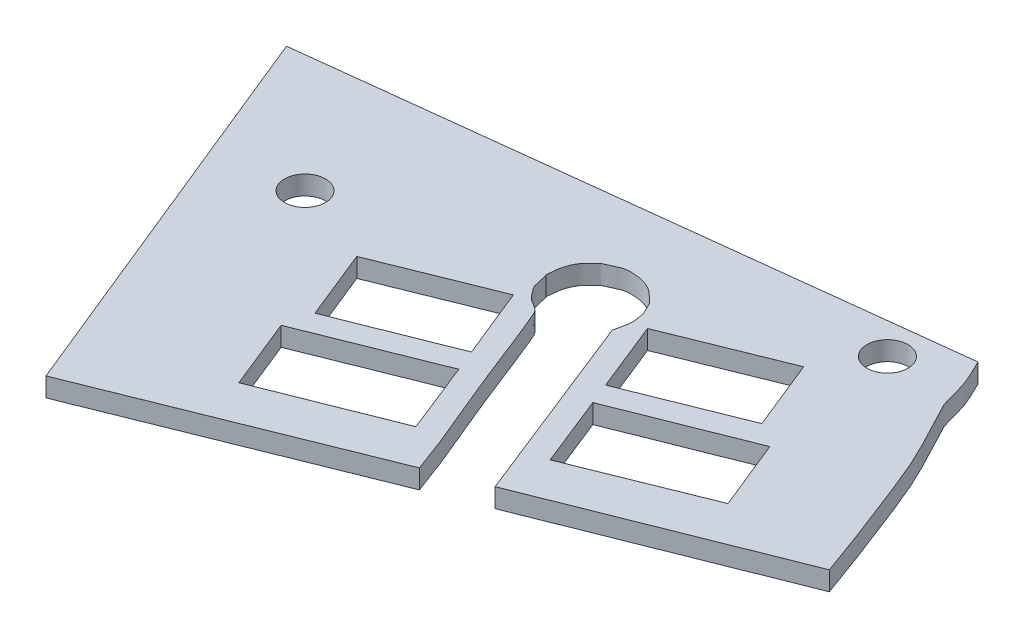
ISO-10303-21;
HEADER;
FILE_DESCRIPTION(('STEP AP214'),'2;1');
FILE_NAME('part.step','',(''),(''),'','','');
FILE_SCHEMA(('AUTOMOTIVE_DESIGN { 1 0 10303 214 1 1 1 1 }'));
ENDSEC;
DATA;
#1=APPLICATION_CONTEXT('core data for automotive mechanical design processes');
#2=APPLICATION_PROTOCOL_DEFINITION('international standard','automotive_design',2000,#1);
#3=PRODUCT_CONTEXT('',#1,'mechanical');
#4=PRODUCT('Part','Part','',(#3));
#5=PRODUCT_RELATED_PRODUCT_CATEGORY('part','',(#4));
#6=PRODUCT_DEFINITION_FORMATION('','',#4);
#7=PRODUCT_DEFINITION_CONTEXT('part definition',#1,'design');
#8=PRODUCT_DEFINITION('design','',#6,#7);
#9=PRODUCT_DEFINITION_SHAPE('','',#8);
#10=(LENGTH_UNIT() NAMED_UNIT(*) SI_UNIT(.MILLI.,.METRE.));
#11=(NAMED_UNIT(*) PLANE_ANGLE_UNIT() SI_UNIT($,.RADIAN.));
#12=(NAMED_UNIT(*) SI_UNIT($,.STERADIAN.) SOLID_ANGLE_UNIT());
#13=UNCERTAINTY_MEASURE_WITH_UNIT(LENGTH_MEASURE(1.E-05),#10,'distance_accuracy_value','');
#14=(GEOMETRIC_REPRESENTATION_CONTEXT(3) GLOBAL_UNCERTAINTY_ASSIGNED_CONTEXT((#13)) GLOBAL_UNIT_ASSIGNED_CONTEXT((#10,
#11,#12)) REPRESENTATION_CONTEXT('',''));
#15=CARTESIAN_POINT('',(0.,0.,0.));
#16=DIRECTION('',(0.,0.,1.));
#17=DIRECTION('',(1.,0.,0.));
#18=AXIS2_PLACEMENT_3D('',#15,#16,#17);
#19=CARTESIAN_POINT('',(35.9788581902602,1.19,-26.9467232131162));
#20=DIRECTION('',(0.,-1.,0.));
#21=DIRECTION('',(0.,0.,-1.));
#22=AXIS2_PLACEMENT_3D('',#19,#20,#21);
#23=PLANE('',#22);
#24=DIRECTION('',(-0.929138932775586,0.,0.369730771779472));
#25=VECTOR('',#24,1.);
#26=CARTESIAN_POINT('',(24.8826001834326,1.19,-16.1536096345668));
#27=LINE('',#26,#25);
#28=CARTESIAN_POINT('',(32.786623966637,1.19,-19.2988451966992));
#29=VERTEX_POINT('',#28);
#30=CARTESIAN_POINT('',(24.8826001834326,1.19,-16.1536096345668));
#31=VERTEX_POINT('',#30);
#32=EDGE_CURVE('E249',#29,#31,#27,.T.);
#33=ORIENTED_EDGE('',*,*,#32,.F.);
#34=DIRECTION('',(-0.374554351369243,0.,-0.927204960011737));
#35=VECTOR('',#34,1.);
#36=CARTESIAN_POINT('',(32.786623966637,1.19,-19.2988451966992));
#37=LINE('',#36,#35);
#38=CARTESIAN_POINT('',(34.559807217706,1.19,-14.9093505895999));
#39=VERTEX_POINT('',#38);
#40=EDGE_CURVE('E260',#39,#29,#37,.T.);
#41=ORIENTED_EDGE('',*,*,#40,.F.);
#42=DIRECTION('',(0.927574779548119,0.,-0.3736375628149));
#43=VECTOR('',#42,1.);
#44=CARTESIAN_POINT('',(34.559807217706,1.19,-14.9093505895999));
#45=LINE('',#44,#43);
#46=CARTESIAN_POINT('',(26.6479258883437,1.19,-11.7223557269067));
#47=VERTEX_POINT('',#46);
#48=EDGE_CURVE('E256',#47,#39,#45,.T.);
#49=ORIENTED_EDGE('',*,*,#48,.F.);
#50=DIRECTION('',(0.370093426325255,0.,0.928994540237365));
#51=VECTOR('',#50,1.);
#52=CARTESIAN_POINT('',(26.6479258883437,1.19,-11.7223557269067));
#53=LINE('',#52,#51);
#54=EDGE_CURVE('E252',#31,#47,#53,.T.);
#55=ORIENTED_EDGE('',*,*,#54,.F.);
#56=EDGE_LOOP('',(#33,#41,#49,#55));
#57=FACE_BOUND('',#56,.T.);
#58=CARTESIAN_POINT('',(4.44394552127311,1.19,-18.6221592118428));
#59=DIRECTION('',(0.,1.,0.));
#60=DIRECTION('',(0.,0.,1.));
#61=AXIS2_PLACEMENT_3D('',#58,#59,#60);
#62=CIRCLE('',#61,1.27912148996529);
#63=CARTESIAN_POINT('',(4.44394552127311,1.19,-17.3430377218775));
#64=VERTEX_POINT('',#63);
#65=EDGE_CURVE('E335',#64,#64,#62,.T.);
#66=ORIENTED_EDGE('',*,*,#65,.F.);
#67=EDGE_LOOP('',(#66));
#68=FACE_BOUND('',#67,.T.);
#69=DIRECTION('',(-0.927373213546552,0.,0.374137572019093));
#70=VECTOR('',#69,1.);
#71=CARTESIAN_POINT('',(22.5826617144535,1.19,-21.8660149868715));
#72=LINE('',#71,#70);
#73=CARTESIAN_POINT('',(29.5280116278823,1.19,-24.6680328966792));
#74=VERTEX_POINT('',#73);
#75=CARTESIAN_POINT('',(22.5826617144535,1.19,-21.8660149868715));
#76=VERTEX_POINT('',#75);
#77=EDGE_CURVE('E343',#74,#76,#72,.T.);
#78=ORIENTED_EDGE('',*,*,#77,.F.);
#79=DIRECTION('',(-0.374514129456685,0.,-0.927221207068357));
#80=VECTOR('',#79,1.);
#81=CARTESIAN_POINT('',(29.5280116278823,1.19,-24.6680328966792));
#82=LINE('',#81,#80);
#83=CARTESIAN_POINT('',(31.2953894742109,1.19,-20.2923629522742));
#84=VERTEX_POINT('',#83);
#85=EDGE_CURVE('E354',#84,#74,#82,.T.);
#86=ORIENTED_EDGE('',*,*,#85,.F.);
#87=DIRECTION('',(0.927982637445173,0.,-0.372623435387928));
#88=VECTOR('',#87,1.);
#89=CARTESIAN_POINT('',(31.2953894742109,1.19,-20.2923629522742));
#90=LINE('',#89,#88);
#91=CARTESIAN_POINT('',(24.3349122983001,1.19,-17.4974432926051));
#92=VERTEX_POINT('',#91);
#93=EDGE_CURVE('E350',#92,#84,#90,.T.);
#94=ORIENTED_EDGE('',*,*,#93,.F.);
#95=DIRECTION('',(0.372273642828144,0.,0.928123017091734));
#96=VECTOR('',#95,1.);
#97=CARTESIAN_POINT('',(24.3349122983001,1.19,-17.4974432926051));
#98=LINE('',#97,#96);
#99=EDGE_CURVE('E346',#76,#92,#98,.T.);
#100=ORIENTED_EDGE('',*,*,#99,.F.);
#101=EDGE_LOOP('',(#78,#86,#94,#100));
#102=FACE_BOUND('',#101,.T.);
#103=DIRECTION('',(0.377265914837246,0.,0.926104977581924));
#104=VECTOR('',#103,1.);
#105=CARTESIAN_POINT('',(6.37170948359056,1.19,-0.524718751833313));
#106=LINE('',#105,#104);
#107=CARTESIAN_POINT('',(-3.94816815876049,1.19,-25.8577522349688));
#108=VERTEX_POINT('',#107);
#109=CARTESIAN_POINT('',(6.37170948359056,1.19,-0.524718751833313));
#110=VERTEX_POINT('',#109);
#111=EDGE_CURVE('E394',#108,#110,#106,.T.);
#112=ORIENTED_EDGE('',*,*,#111,.T.);
#113=DIRECTION('',(0.927877448229034,0.,-0.372885292104658));
#114=VECTOR('',#113,1.);
#115=CARTESIAN_POINT('',(22.9999228700686,1.19,-7.20708420605326));
#116=LINE('',#115,#114);
#117=CARTESIAN_POINT('',(22.9999228700686,1.19,-7.20708420605326));
#118=VERTEX_POINT('',#117);
#119=EDGE_CURVE('E398',#110,#118,#116,.T.);
#120=ORIENTED_EDGE('',*,*,#119,.T.);
#121=CARTESIAN_POINT('',(22.9999228700686,1.19,-7.20708420605326));
#122=CARTESIAN_POINT('',(22.0115475346655,1.19,-9.98661151399347));
#123=CARTESIAN_POINT('',(21.5188945967217,1.19,-10.8820647279259));
#124=CARTESIAN_POINT('',(20.0021583951109,1.19,-14.686998305048));
#125=CARTESIAN_POINT('',(19.3466827716481,1.19,-16.3313456912646));
#126=CARTESIAN_POINT('',(19.1275109478908,1.19,-16.988826809381));
#127=CARTESIAN_POINT('',(18.2342460124436,1.19,-19.0982296967628));
#128=CARTESIAN_POINT('',(18.0311634837373,1.19,-19.5777994810791));
#129=CARTESIAN_POINT('',(17.4655783405814,1.19,-19.6171123035761));
#130=CARTESIAN_POINT('',(17.1976734702197,1.19,-20.0183884446883));
#131=CARTESIAN_POINT('',(17.0440445021911,1.19,-20.2484986303312));
#132=CARTESIAN_POINT('',(16.8068058528764,1.19,-20.4410440927477));
#133=CARTESIAN_POINT('',(16.7367865661339,1.19,-20.708719001617));
#134=CARTESIAN_POINT('',(16.6637645790077,1.19,-20.9878728556309));
#135=CARTESIAN_POINT('',(16.617400623009,1.19,-21.2735503084374));
#136=CARTESIAN_POINT('',(16.5443786358828,1.19,-21.5527041624513));
#137=CARTESIAN_POINT('',(16.5398013319158,1.19,-21.5702026186516));
#138=CARTESIAN_POINT('',(16.5187823531704,1.19,-21.5782662639945));
#139=CARTESIAN_POINT('',(16.5059842118141,1.19,-21.5910473147661));
#140=B_SPLINE_CURVE_WITH_KNOTS('',3,(#121,#122,#123,#124,#125,#126,#127,#128,#129,#130,#131,
#132,#133,#134,#135,#136,#137,#138,#139),.UNSPECIFIED.,.F.,.F.,(4,3,3,3,3,3,4),(0.,1.,2.,3.,4.,
5.,6.),.UNSPECIFIED.);
#141=CARTESIAN_POINT('',(16.5059842118141,1.19,-21.5910473147661));
#142=VERTEX_POINT('',#141);
#143=EDGE_CURVE('E402',#118,#142,#140,.T.);
#144=ORIENTED_EDGE('',*,*,#143,.T.);
#145=CARTESIAN_POINT('',(16.5059842118141,1.19,-21.5910473147661));
#146=CARTESIAN_POINT('',(16.5442005480148,1.19,-21.885227935876));
#147=CARTESIAN_POINT('',(16.5456222551934,1.19,-22.1865768416264));
#148=CARTESIAN_POINT('',(16.6206332204162,1.19,-22.4735891780956));
#149=CARTESIAN_POINT('',(16.6873028559704,1.19,-22.7286853205747));
#150=CARTESIAN_POINT('',(16.7797045426985,1.19,-22.9842094668508));
#151=CARTESIAN_POINT('',(16.927205728982,1.19,-23.2027553024496));
#152=CARTESIAN_POINT('',(17.1043517025042,1.19,-23.4652244783381));
#153=CARTESIAN_POINT('',(17.3614582266607,1.19,-23.6637417898316));
#154=CARTESIAN_POINT('',(17.5791172474616,1.19,-23.8937316045859));
#155=CARTESIAN_POINT('',(17.5915498323038,1.19,-23.9068685188028));
#156=CARTESIAN_POINT('',(17.6011399453458,1.19,-23.9243355141276));
#157=CARTESIAN_POINT('',(17.6174661535773,1.19,-23.9321202816761));
#158=CARTESIAN_POINT('',(17.8706540099005,1.19,-24.0528469427378));
#159=CARTESIAN_POINT('',(18.1314751599277,1.19,-24.157110454786));
#160=CARTESIAN_POINT('',(18.3846630162509,1.19,-24.2778371158476));
#161=CARTESIAN_POINT('',(18.7432825901617,1.19,-24.4488364061703));
#162=CARTESIAN_POINT('',(19.1802781374837,1.19,-24.4079919107509));
#163=CARTESIAN_POINT('',(19.5740557849677,1.19,-24.3551911491583));
#164=CARTESIAN_POINT('',(19.870796871569,1.19,-24.3154018023823));
#165=CARTESIAN_POINT('',(20.1598661302531,1.19,-24.1997934174334));
#166=CARTESIAN_POINT('',(20.4183282841305,1.19,-24.0486782970542));
#167=CARTESIAN_POINT('',(20.6925799422208,1.19,-23.888331524017));
#168=CARTESIAN_POINT('',(20.9054886390425,1.19,-23.640779489755));
#169=CARTESIAN_POINT('',(21.1476534923825,1.19,-23.4351554556649));
#170=CARTESIAN_POINT('',(21.3834549378282,1.19,-23.2349346400177));
#171=CARTESIAN_POINT('',(21.4548822220276,1.19,-22.8981514571216));
#172=CARTESIAN_POINT('',(21.6084965868502,1.19,-22.62964945785));
#173=CARTESIAN_POINT('',(21.6174785008867,1.19,-22.6139500024059));
#174=CARTESIAN_POINT('',(21.6439024964264,1.19,-22.6091401363415));
#175=CARTESIAN_POINT('',(21.6468852639403,1.19,-22.5913005517343));
#176=CARTESIAN_POINT('',(21.6958062885552,1.19,-22.2987096093937));
#177=CARTESIAN_POINT('',(21.7741519992741,1.19,-22.0052996032961));
#178=CARTESIAN_POINT('',(21.7624490049559,1.19,-21.7088780013283));
#179=CARTESIAN_POINT('',(21.7485944835091,1.19,-21.3579610197319));
#180=CARTESIAN_POINT('',(21.6349109717166,1.19,-21.0181734675178));
#181=CARTESIAN_POINT('',(21.571141955097,1.19,-20.6728212006125));
#182=B_SPLINE_CURVE_WITH_KNOTS('',3,(#145,#146,#147,#148,#149,#150,#151,#152,#153,#154,#155,
#156,#157,#158,#159,#160,#161,#162,#163,#164,#165,#166,#167,#168,#169,#170,#171,#172,#173,#174,
#175,#176,#177,#178,#179,#180,#181),.UNSPECIFIED.,.F.,.F.,(4,3,3,3,3,3,3,3,3,3,3,3,4),(0.,1.,2.,
3.,4.,5.,6.,7.,8.,9.,10.,11.,12.),.UNSPECIFIED.);
#183=CARTESIAN_POINT('',(21.571141955097,1.19,-20.6728212006125));
#184=VERTEX_POINT('',#183);
#185=EDGE_CURVE('E408',#142,#184,#182,.T.);
#186=ORIENTED_EDGE('',*,*,#185,.T.);
#187=DIRECTION('',(0.36884552030541,0.,0.929490711169634));
#188=VECTOR('',#187,1.);
#189=CARTESIAN_POINT('',(26.3793084328849,1.19,-8.55624167658697));
#190=LINE('',#189,#188);
#191=CARTESIAN_POINT('',(26.3793084328849,1.19,-8.55624167658697));
#192=VERTEX_POINT('',#191);
#193=EDGE_CURVE('E549',#184,#192,#190,.T.);
#194=ORIENTED_EDGE('',*,*,#193,.T.);
#195=DIRECTION('',(0.929176749845426,0.,-0.369635722768635));
#196=VECTOR('',#195,1.);
#197=CARTESIAN_POINT('',(41.3064860387741,1.19,-14.4944209133861));
#198=LINE('',#197,#196);
#199=CARTESIAN_POINT('',(41.3064860387741,1.19,-14.4944209133861));
#200=VERTEX_POINT('',#199);
#201=EDGE_CURVE('E463',#192,#200,#198,.T.);
#202=ORIENTED_EDGE('',*,*,#201,.T.);
#203=CARTESIAN_POINT('',(41.3064860387741,1.19,-14.4944209133861));
#204=CARTESIAN_POINT('',(40.4413769049084,1.19,-16.9603625473752));
#205=CARTESIAN_POINT('',(38.8653273947854,1.19,-21.0390813626115));
#206=CARTESIAN_POINT('',(38.2178251849978,1.19,-22.5309199781212));
#207=CARTESIAN_POINT('',(37.5641807720796,1.19,-24.0369101682144));
#208=CARTESIAN_POINT('',(36.7438854848778,1.19,-25.4649666392258));
#209=CARTESIAN_POINT('',(35.9992618023672,1.19,-26.9281115543455));
#210=CARTESIAN_POINT('',(35.9910572987333,1.19,-26.9442329564106));
#211=CARTESIAN_POINT('',(35.9659381842422,1.19,-26.9489216293106));
#212=CARTESIAN_POINT('',(35.9606172707881,1.19,-26.9662103934202));
#213=CARTESIAN_POINT('',(35.7688797215146,1.19,-27.5892059164559));
#214=CARTESIAN_POINT('',(35.6349446760462,1.19,-28.230797201937));
#215=CARTESIAN_POINT('',(35.4100442098563,1.19,-28.8426031269095));
#216=CARTESIAN_POINT('',(35.2164658014839,1.19,-29.3692023785491));
#217=CARTESIAN_POINT('',(34.9423080858761,1.19,-29.8625739139352));
#218=CARTESIAN_POINT('',(34.7084400238859,1.19,-30.3725593074478));
#219=B_SPLINE_CURVE_WITH_KNOTS('',3,(#203,#204,#205,#206,#207,#208,#209,#210,#211,#212,#213,
#214,#215,#216,#217,#218),.UNSPECIFIED.,.F.,.F.,(4,3,3,3,3,4),(0.,1.,2.,3.,4.,5.),.UNSPECIFIED.);
#220=CARTESIAN_POINT('',(34.708440023886,1.19,-30.3725593074478));
#221=VERTEX_POINT('',#220);
#222=EDGE_CURVE('E455',#200,#221,#219,.T.);
#223=ORIENTED_EDGE('',*,*,#222,.T.);
#224=DIRECTION('',(-0.99324873051463,0.,0.116004134974039));
#225=VECTOR('',#224,1.);
#226=CARTESIAN_POINT('',(-3.94816815876049,1.19,-25.8577522349688));
#227=LINE('',#226,#225);
#228=EDGE_CURVE('E462',#221,#108,#227,.T.);
#229=ORIENTED_EDGE('',*,*,#228,.T.);
#230=EDGE_LOOP('',(#112,#120,#144,#186,#194,#202,#223,#229));
#231=FACE_BOUND('',#230,.T.);
#232=CARTESIAN_POINT('',(31.5819941178303,1.19,-27.8440418080723));
#233=DIRECTION('',(0.,1.,0.));
#234=DIRECTION('',(0.,0.,1.));
#235=AXIS2_PLACEMENT_3D('',#232,#233,#234);
#236=CIRCLE('',#235,1.28155859149822);
#237=CARTESIAN_POINT('',(31.5819941178303,1.19,-26.562483216574));
#238=VERTEX_POINT('',#237);
#239=EDGE_CURVE('E386',#238,#238,#236,.T.);
#240=ORIENTED_EDGE('',*,*,#239,.F.);
#241=EDGE_LOOP('',(#240));
#242=FACE_BOUND('',#241,.T.);
#243=DIRECTION('',(-0.927552927526245,0.,0.373691807024842));
#244=VECTOR('',#243,1.);
#245=CARTESIAN_POINT('',(9.61148219190338,1.19,-16.6865765167537));
#246=LINE('',#245,#244);
#247=CARTESIAN_POINT('',(16.5777826434056,1.19,-19.4931542620719));
#248=VERTEX_POINT('',#247);
#249=CARTESIAN_POINT('',(9.61148219190338,1.19,-16.6865765167537));
#250=VERTEX_POINT('',#249);
#251=EDGE_CURVE('E292',#248,#250,#246,.T.);
#252=ORIENTED_EDGE('',*,*,#251,.F.);
#253=DIRECTION('',(-0.376190054881045,0.,-0.926542520669503));
#254=VECTOR('',#253,1.);
#255=CARTESIAN_POINT('',(16.5777826434056,1.19,-19.4931542620719));
#256=LINE('',#255,#254);
#257=CARTESIAN_POINT('',(18.3622953881469,1.19,-15.0979638118557));
#258=VERTEX_POINT('',#257);
#259=EDGE_CURVE('E303',#258,#248,#256,.T.);
#260=ORIENTED_EDGE('',*,*,#259,.F.);
#261=DIRECTION('',(0.928917581818053,0.,-0.370286546054944));
#262=VECTOR('',#261,1.);
#263=CARTESIAN_POINT('',(18.3622953881469,1.19,-15.0979638118557));
#264=LINE('',#263,#262);
#265=CARTESIAN_POINT('',(11.3765404474495,1.19,-12.313291501623));
#266=VERTEX_POINT('',#265);
#267=EDGE_CURVE('E299',#266,#258,#264,.T.);
#268=ORIENTED_EDGE('',*,*,#267,.F.);
#269=DIRECTION('',(0.374266862491585,0.,0.927321042379987));
#270=VECTOR('',#269,1.);
#271=CARTESIAN_POINT('',(11.3765404474495,1.19,-12.313291501623));
#272=LINE('',#271,#270);
#273=EDGE_CURVE('E295',#250,#266,#272,.T.);
#274=ORIENTED_EDGE('',*,*,#273,.F.);
#275=EDGE_LOOP('',(#252,#260,#268,#274));
#276=FACE_BOUND('',#275,.T.);
#277=DIRECTION('',(-0.928430752049238,0.,0.371505502851958));
#278=VECTOR('',#277,1.);
#279=CARTESIAN_POINT('',(10.9742868291819,1.19,-10.6018672582041));
#280=LINE('',#279,#278);
#281=CARTESIAN_POINT('',(18.8983631390084,1.19,-13.7726346499797));
#282=VERTEX_POINT('',#281);
#283=CARTESIAN_POINT('',(10.9742868291819,1.19,-10.6018672582041));
#284=VERTEX_POINT('',#283);
#285=EDGE_CURVE('E201',#282,#284,#280,.T.);
#286=ORIENTED_EDGE('',*,*,#285,.F.);
#287=DIRECTION('',(-0.368443162094009,0.,-0.929650276343834));
#288=VECTOR('',#287,1.);
#289=CARTESIAN_POINT('',(18.8983631390084,1.19,-13.7726346499797));
#290=LINE('',#289,#288);
#291=CARTESIAN_POINT('',(20.6613006065998,1.19,-9.32441719736461));
#292=VERTEX_POINT('',#291);
#293=EDGE_CURVE('E227',#292,#282,#290,.T.);
#294=ORIENTED_EDGE('',*,*,#293,.F.);
#295=DIRECTION('',(0.929050715962762,0.,-0.369952385002557));
#296=VECTOR('',#295,1.);
#297=CARTESIAN_POINT('',(20.6613006065998,1.19,-9.32441719736461));
#298=LINE('',#297,#296);
#299=CARTESIAN_POINT('',(12.7598826331458,1.19,-6.17803522493142));
#300=VERTEX_POINT('',#299);
#301=EDGE_CURVE('E223',#300,#292,#298,.T.);
#302=ORIENTED_EDGE('',*,*,#301,.F.);
#303=DIRECTION('',(0.374291515280119,0.,0.927311092131067));
#304=VECTOR('',#303,1.);
#305=CARTESIAN_POINT('',(12.7598826331458,1.19,-6.17803522493142));
#306=LINE('',#305,#304);
#307=EDGE_CURVE('E210',#284,#300,#306,.T.);
#308=ORIENTED_EDGE('',*,*,#307,.F.);
#309=EDGE_LOOP('',(#286,#294,#302,#308));
#310=FACE_BOUND('',#309,.T.);
#311=ADVANCED_FACE('F39',(#57,#68,#102,#231,#242,#276,#310),#23,.F.);
#312=CARTESIAN_POINT('',(35.9788581902602,0.,-26.9467232131162));
#313=DIRECTION('',(0.,-1.,0.));
#314=DIRECTION('',(0.,0.,-1.));
#315=AXIS2_PLACEMENT_3D('',#312,#313,#314);
#316=PLANE('',#315);
#317=DIRECTION('',(-0.374514129456685,0.,-0.927221207068357));
#318=VECTOR('',#317,1.);
#319=CARTESIAN_POINT('',(29.5280116278823,0.,-24.6680328966792));
#320=LINE('',#319,#318);
#321=CARTESIAN_POINT('',(31.2953894742109,0.,-20.2923629522742));
#322=VERTEX_POINT('',#321);
#323=CARTESIAN_POINT('',(29.5280116278823,0.,-24.6680328966792));
#324=VERTEX_POINT('',#323);
#325=EDGE_CURVE('E347',#322,#324,#320,.T.);
#326=ORIENTED_EDGE('',*,*,#325,.T.);
#327=DIRECTION('',(-0.927373213546552,0.,0.374137572019093));
#328=VECTOR('',#327,1.);
#329=CARTESIAN_POINT('',(22.5826617144535,0.,-21.8660149868715));
#330=LINE('',#329,#328);
#331=CARTESIAN_POINT('',(22.5826617144535,0.,-21.8660149868715));
#332=VERTEX_POINT('',#331);
#333=EDGE_CURVE('E339',#324,#332,#330,.T.);
#334=ORIENTED_EDGE('',*,*,#333,.T.);
#335=DIRECTION('',(0.372273642828144,0.,0.928123017091734));
#336=VECTOR('',#335,1.);
#337=CARTESIAN_POINT('',(24.3349122983001,0.,-17.4974432926051));
#338=LINE('',#337,#336);
#339=CARTESIAN_POINT('',(24.3349122983001,0.,-17.4974432926051));
#340=VERTEX_POINT('',#339);
#341=EDGE_CURVE('E361',#332,#340,#338,.T.);
#342=ORIENTED_EDGE('',*,*,#341,.T.);
#343=DIRECTION('',(0.927982637445173,0.,-0.372623435387928));
#344=VECTOR('',#343,1.);
#345=CARTESIAN_POINT('',(31.2953894742109,0.,-20.2923629522742));
#346=LINE('',#345,#344);
#347=EDGE_CURVE('E365',#340,#322,#346,.T.);
#348=ORIENTED_EDGE('',*,*,#347,.T.);
#349=EDGE_LOOP('',(#326,#334,#342,#348));
#350=FACE_BOUND('',#349,.T.);
#351=CARTESIAN_POINT('',(31.5819941178303,0.,-27.8440418080723));
#352=DIRECTION('',(0.,1.,0.));
#353=DIRECTION('',(0.,0.,1.));
#354=AXIS2_PLACEMENT_3D('',#351,#352,#353);
#355=CIRCLE('',#354,1.28155859149822);
#356=CARTESIAN_POINT('',(31.5819941178303,0.,-26.562483216574));
#357=VERTEX_POINT('',#356);
#358=EDGE_CURVE('E385',#357,#357,#355,.T.);
#359=ORIENTED_EDGE('',*,*,#358,.T.);
#360=EDGE_LOOP('',(#359));
#361=FACE_BOUND('',#360,.T.);
#362=DIRECTION('',(0.377265914837246,0.,0.926104977581924));
#363=VECTOR('',#362,1.);
#364=CARTESIAN_POINT('',(6.37170948359056,0.,-0.524718751833313));
#365=LINE('',#364,#363);
#366=CARTESIAN_POINT('',(-3.94816815876049,0.,-25.8577522349688));
#367=VERTEX_POINT('',#366);
#368=CARTESIAN_POINT('',(6.37170948359056,0.,-0.524718751833313));
#369=VERTEX_POINT('',#368);
#370=EDGE_CURVE('E390',#367,#369,#365,.T.);
#371=ORIENTED_EDGE('',*,*,#370,.F.);
#372=DIRECTION('',(-0.99324873051463,0.,0.116004134974039));
#373=VECTOR('',#372,1.);
#374=CARTESIAN_POINT('',(-3.94816815876049,0.,-25.8577522349688));
#375=LINE('',#374,#373);
#376=CARTESIAN_POINT('',(34.708440023886,0.,-30.3725593074478));
#377=VERTEX_POINT('',#376);
#378=EDGE_CURVE('E399',#377,#367,#375,.T.);
#379=ORIENTED_EDGE('',*,*,#378,.F.);
#380=CARTESIAN_POINT('',(41.3064860387741,0.,-14.4944209133861));
#381=CARTESIAN_POINT('',(40.4413769049084,0.,-16.9603625473752));
#382=CARTESIAN_POINT('',(38.8653273947854,0.,-21.0390813626115));
#383=CARTESIAN_POINT('',(38.2178251849978,0.,-22.5309199781212));
#384=CARTESIAN_POINT('',(37.5641807720796,0.,-24.0369101682144));
#385=CARTESIAN_POINT('',(36.7438854848778,0.,-25.4649666392258));
#386=CARTESIAN_POINT('',(35.9992618023672,0.,-26.9281115543455));
#387=CARTESIAN_POINT('',(35.9910572987333,0.,-26.9442329564106));
#388=CARTESIAN_POINT('',(35.9659381842422,0.,-26.9489216293106));
#389=CARTESIAN_POINT('',(35.9606172707881,0.,-26.9662103934202));
#390=CARTESIAN_POINT('',(35.7688797215146,0.,-27.5892059164559));
#391=CARTESIAN_POINT('',(35.6349446760462,0.,-28.230797201937));
#392=CARTESIAN_POINT('',(35.4100442098563,0.,-28.8426031269095));
#393=CARTESIAN_POINT('',(35.2164658014839,0.,-29.3692023785491));
#394=CARTESIAN_POINT('',(34.9423080858761,0.,-29.8625739139352));
#395=CARTESIAN_POINT('',(34.7084400238859,0.,-30.3725593074478));
#396=B_SPLINE_CURVE_WITH_KNOTS('',3,(#380,#381,#382,#383,#384,#385,#386,#387,#388,#389,#390,
#391,#392,#393,#394,#395),.UNSPECIFIED.,.F.,.F.,(4,3,3,3,3,4),(0.,1.,2.,3.,4.,5.),.UNSPECIFIED.);
#397=CARTESIAN_POINT('',(41.3064860387741,0.,-14.4944209133861));
#398=VERTEX_POINT('',#397);
#399=EDGE_CURVE('E498',#398,#377,#396,.T.);
#400=ORIENTED_EDGE('',*,*,#399,.F.);
#401=DIRECTION('',(0.929176749845426,0.,-0.369635722768635));
#402=VECTOR('',#401,1.);
#403=CARTESIAN_POINT('',(41.3064860387741,0.,-14.4944209133861));
#404=LINE('',#403,#402);
#405=CARTESIAN_POINT('',(26.3793084328849,0.,-8.55624167658697));
#406=VERTEX_POINT('',#405);
#407=EDGE_CURVE('E495',#406,#398,#404,.T.);
#408=ORIENTED_EDGE('',*,*,#407,.F.);
#409=DIRECTION('',(0.36884552030541,0.,0.929490711169634));
#410=VECTOR('',#409,1.);
#411=CARTESIAN_POINT('',(26.3793084328849,0.,-8.55624167658697));
#412=LINE('',#411,#410);
#413=CARTESIAN_POINT('',(21.571141955097,0.,-20.6728212006125));
#414=VERTEX_POINT('',#413);
#415=EDGE_CURVE('E489',#414,#406,#412,.T.);
#416=ORIENTED_EDGE('',*,*,#415,.F.);
#417=CARTESIAN_POINT('',(16.5059842118141,0.,-21.5910473147661));
#418=CARTESIAN_POINT('',(16.5442005480148,0.,-21.885227935876));
#419=CARTESIAN_POINT('',(16.5456222551934,0.,-22.1865768416264));
#420=CARTESIAN_POINT('',(16.6206332204162,0.,-22.4735891780956));
#421=CARTESIAN_POINT('',(16.6873028559704,0.,-22.7286853205747));
#422=CARTESIAN_POINT('',(16.7797045426985,0.,-22.9842094668508));
#423=CARTESIAN_POINT('',(16.927205728982,0.,-23.2027553024496));
#424=CARTESIAN_POINT('',(17.1043517025042,0.,-23.4652244783381));
#425=CARTESIAN_POINT('',(17.3614582266607,0.,-23.6637417898316));
#426=CARTESIAN_POINT('',(17.5791172474616,0.,-23.8937316045859));
#427=CARTESIAN_POINT('',(17.5915498323038,0.,-23.9068685188028));
#428=CARTESIAN_POINT('',(17.6011399453458,0.,-23.9243355141276));
#429=CARTESIAN_POINT('',(17.6174661535773,0.,-23.9321202816761));
#430=CARTESIAN_POINT('',(17.8706540099005,0.,-24.0528469427378));
#431=CARTESIAN_POINT('',(18.1314751599277,0.,-24.157110454786));
#432=CARTESIAN_POINT('',(18.3846630162509,0.,-24.2778371158476));
#433=CARTESIAN_POINT('',(18.7432825901617,0.,-24.4488364061703));
#434=CARTESIAN_POINT('',(19.1802781374837,0.,-24.4079919107509));
#435=CARTESIAN_POINT('',(19.5740557849677,0.,-24.3551911491583));
#436=CARTESIAN_POINT('',(19.870796871569,0.,-24.3154018023823));
#437=CARTESIAN_POINT('',(20.1598661302531,0.,-24.1997934174334));
#438=CARTESIAN_POINT('',(20.4183282841305,0.,-24.0486782970542));
#439=CARTESIAN_POINT('',(20.6925799422208,0.,-23.888331524017));
#440=CARTESIAN_POINT('',(20.9054886390425,0.,-23.640779489755));
#441=CARTESIAN_POINT('',(21.1476534923825,0.,-23.4351554556649));
#442=CARTESIAN_POINT('',(21.3834549378282,0.,-23.2349346400177));
#443=CARTESIAN_POINT('',(21.4548822220276,0.,-22.8981514571216));
#444=CARTESIAN_POINT('',(21.6084965868502,0.,-22.62964945785));
#445=CARTESIAN_POINT('',(21.6174785008867,0.,-22.6139500024059));
#446=CARTESIAN_POINT('',(21.6439024964264,0.,-22.6091401363415));
#447=CARTESIAN_POINT('',(21.6468852639403,0.,-22.5913005517343));
#448=CARTESIAN_POINT('',(21.6958062885552,0.,-22.2987096093937));
#449=CARTESIAN_POINT('',(21.7741519992741,0.,-22.0052996032961));
#450=CARTESIAN_POINT('',(21.7624490049559,0.,-21.7088780013283));
#451=CARTESIAN_POINT('',(21.7485944835091,0.,-21.3579610197319));
#452=CARTESIAN_POINT('',(21.6349109717166,0.,-21.0181734675178));
#453=CARTESIAN_POINT('',(21.571141955097,0.,-20.6728212006125));
#454=B_SPLINE_CURVE_WITH_KNOTS('',3,(#417,#418,#419,#420,#421,#422,#423,#424,#425,#426,#427,
#428,#429,#430,#431,#432,#433,#434,#435,#436,#437,#438,#439,#440,#441,#442,#443,#444,#445,#446,
#447,#448,#449,#450,#451,#452,#453),.UNSPECIFIED.,.F.,.F.,(4,3,3,3,3,3,3,3,3,3,3,3,4),(0.,1.,2.,
3.,4.,5.,6.,7.,8.,9.,10.,11.,12.),.UNSPECIFIED.);
#455=CARTESIAN_POINT('',(16.5059842118141,0.,-21.5910473147661));
#456=VERTEX_POINT('',#455);
#457=EDGE_CURVE('E481',#456,#414,#454,.T.);
#458=ORIENTED_EDGE('',*,*,#457,.F.);
#459=CARTESIAN_POINT('',(22.9999228700686,0.,-7.20708420605326));
#460=CARTESIAN_POINT('',(22.0115475346655,0.,-9.98661151399347));
#461=CARTESIAN_POINT('',(21.5188945967217,0.,-10.8820647279259));
#462=CARTESIAN_POINT('',(20.0021583951109,0.,-14.686998305048));
#463=CARTESIAN_POINT('',(19.3466827716481,0.,-16.3313456912646));
#464=CARTESIAN_POINT('',(19.1275109478908,0.,-16.988826809381));
#465=CARTESIAN_POINT('',(18.2342460124436,0.,-19.0982296967628));
#466=CARTESIAN_POINT('',(18.0311634837373,0.,-19.5777994810791));
#467=CARTESIAN_POINT('',(17.4655783405814,0.,-19.6171123035761));
#468=CARTESIAN_POINT('',(17.1976734702197,0.,-20.0183884446883));
#469=CARTESIAN_POINT('',(17.0440445021911,0.,-20.2484986303312));
#470=CARTESIAN_POINT('',(16.8068058528764,0.,-20.4410440927477));
#471=CARTESIAN_POINT('',(16.7367865661339,0.,-20.708719001617));
#472=CARTESIAN_POINT('',(16.6637645790077,0.,-20.9878728556309));
#473=CARTESIAN_POINT('',(16.617400623009,0.,-21.2735503084374));
#474=CARTESIAN_POINT('',(16.5443786358828,0.,-21.5527041624513));
#475=CARTESIAN_POINT('',(16.5398013319158,0.,-21.5702026186516));
#476=CARTESIAN_POINT('',(16.5187823531704,0.,-21.5782662639945));
#477=CARTESIAN_POINT('',(16.5059842118141,0.,-21.5910473147661));
#478=B_SPLINE_CURVE_WITH_KNOTS('',3,(#459,#460,#461,#462,#463,#464,#465,#466,#467,#468,#469,
#470,#471,#472,#473,#474,#475,#476,#477),.UNSPECIFIED.,.F.,.F.,(4,3,3,3,3,3,4),(0.,1.,2.,3.,4.,
5.,6.),.UNSPECIFIED.);
#479=CARTESIAN_POINT('',(22.9999228700686,0.,-7.20708420605326));
#480=VERTEX_POINT('',#479);
#481=EDGE_CURVE('E476',#480,#456,#478,.T.);
#482=ORIENTED_EDGE('',*,*,#481,.F.);
#483=DIRECTION('',(0.927877448229034,0.,-0.372885292104658));
#484=VECTOR('',#483,1.);
#485=CARTESIAN_POINT('',(22.9999228700686,0.,-7.20708420605326));
#486=LINE('',#485,#484);
#487=EDGE_CURVE('E473',#369,#480,#486,.T.);
#488=ORIENTED_EDGE('',*,*,#487,.F.);
#489=EDGE_LOOP('',(#371,#379,#400,#408,#416,#458,#482,#488));
#490=FACE_BOUND('',#489,.T.);
#491=CARTESIAN_POINT('',(4.44394552127311,0.,-18.6221592118428));
#492=DIRECTION('',(0.,1.,0.));
#493=DIRECTION('',(0.,0.,1.));
#494=AXIS2_PLACEMENT_3D('',#491,#492,#493);
#495=CIRCLE('',#494,1.27912148996529);
#496=CARTESIAN_POINT('',(4.44394552127311,0.,-17.3430377218775));
#497=VERTEX_POINT('',#496);
#498=EDGE_CURVE('E334',#497,#497,#495,.T.);
#499=ORIENTED_EDGE('',*,*,#498,.T.);
#500=EDGE_LOOP('',(#499));
#501=FACE_BOUND('',#500,.T.);
#502=DIRECTION('',(-0.376190054881045,0.,-0.926542520669503));
#503=VECTOR('',#502,1.);
#504=CARTESIAN_POINT('',(16.5777826434056,0.,-19.4931542620719));
#505=LINE('',#504,#503);
#506=CARTESIAN_POINT('',(18.3622953881469,0.,-15.0979638118557));
#507=VERTEX_POINT('',#506);
#508=CARTESIAN_POINT('',(16.5777826434056,0.,-19.4931542620719));
#509=VERTEX_POINT('',#508);
#510=EDGE_CURVE('E296',#507,#509,#505,.T.);
#511=ORIENTED_EDGE('',*,*,#510,.T.);
#512=DIRECTION('',(-0.927552927526245,0.,0.373691807024842));
#513=VECTOR('',#512,1.);
#514=CARTESIAN_POINT('',(9.61148219190338,0.,-16.6865765167537));
#515=LINE('',#514,#513);
#516=CARTESIAN_POINT('',(9.61148219190338,0.,-16.6865765167537));
#517=VERTEX_POINT('',#516);
#518=EDGE_CURVE('E291',#509,#517,#515,.T.);
#519=ORIENTED_EDGE('',*,*,#518,.T.);
#520=DIRECTION('',(0.374266862491585,0.,0.927321042379987));
#521=VECTOR('',#520,1.);
#522=CARTESIAN_POINT('',(11.3765404474495,0.,-12.313291501623));
#523=LINE('',#522,#521);
#524=CARTESIAN_POINT('',(11.3765404474495,0.,-12.313291501623));
#525=VERTEX_POINT('',#524);
#526=EDGE_CURVE('E310',#517,#525,#523,.T.);
#527=ORIENTED_EDGE('',*,*,#526,.T.);
#528=DIRECTION('',(0.928917581818053,0.,-0.370286546054944));
#529=VECTOR('',#528,1.);
#530=CARTESIAN_POINT('',(18.3622953881469,0.,-15.0979638118557));
#531=LINE('',#530,#529);
#532=EDGE_CURVE('E314',#525,#507,#531,.T.);
#533=ORIENTED_EDGE('',*,*,#532,.T.);
#534=EDGE_LOOP('',(#511,#519,#527,#533));
#535=FACE_BOUND('',#534,.T.);
#536=DIRECTION('',(-0.374554351369243,0.,-0.927204960011737));
#537=VECTOR('',#536,1.);
#538=CARTESIAN_POINT('',(32.786623966637,0.,-19.2988451966992));
#539=LINE('',#538,#537);
#540=CARTESIAN_POINT('',(34.559807217706,0.,-14.9093505895999));
#541=VERTEX_POINT('',#540);
#542=CARTESIAN_POINT('',(32.786623966637,0.,-19.2988451966992));
#543=VERTEX_POINT('',#542);
#544=EDGE_CURVE('E253',#541,#543,#539,.T.);
#545=ORIENTED_EDGE('',*,*,#544,.T.);
#546=DIRECTION('',(-0.929138932775586,0.,0.369730771779472));
#547=VECTOR('',#546,1.);
#548=CARTESIAN_POINT('',(24.8826001834326,0.,-16.1536096345668));
#549=LINE('',#548,#547);
#550=CARTESIAN_POINT('',(24.8826001834326,0.,-16.1536096345668));
#551=VERTEX_POINT('',#550);
#552=EDGE_CURVE('E219',#543,#551,#549,.T.);
#553=ORIENTED_EDGE('',*,*,#552,.T.);
#554=DIRECTION('',(0.370093426325255,0.,0.928994540237365));
#555=VECTOR('',#554,1.);
#556=CARTESIAN_POINT('',(26.6479258883437,0.,-11.7223557269067));
#557=LINE('',#556,#555);
#558=CARTESIAN_POINT('',(26.6479258883437,0.,-11.7223557269067));
#559=VERTEX_POINT('',#558);
#560=EDGE_CURVE('E267',#551,#559,#557,.T.);
#561=ORIENTED_EDGE('',*,*,#560,.T.);
#562=DIRECTION('',(0.927574779548119,0.,-0.3736375628149));
#563=VECTOR('',#562,1.);
#564=CARTESIAN_POINT('',(34.559807217706,0.,-14.9093505895999));
#565=LINE('',#564,#563);
#566=EDGE_CURVE('E271',#559,#541,#565,.T.);
#567=ORIENTED_EDGE('',*,*,#566,.T.);
#568=EDGE_LOOP('',(#545,#553,#561,#567));
#569=FACE_BOUND('',#568,.T.);
#570=DIRECTION('',(-0.368443162094009,0.,-0.929650276343834));
#571=VECTOR('',#570,1.);
#572=CARTESIAN_POINT('',(18.8983631390084,0.,-13.7726346499797));
#573=LINE('',#572,#571);
#574=CARTESIAN_POINT('',(20.6613006065998,0.,-9.32441719736461));
#575=VERTEX_POINT('',#574);
#576=CARTESIAN_POINT('',(18.8983631390084,0.,-13.7726346499797));
#577=VERTEX_POINT('',#576);
#578=EDGE_CURVE('E211',#575,#577,#573,.T.);
#579=ORIENTED_EDGE('',*,*,#578,.T.);
#580=DIRECTION('',(-0.928430752049238,0.,0.371505502851958));
#581=VECTOR('',#580,1.);
#582=CARTESIAN_POINT('',(10.9742868291819,0.,-10.6018672582041));
#583=LINE('',#582,#581);
#584=CARTESIAN_POINT('',(10.9742868291819,0.,-10.6018672582041));
#585=VERTEX_POINT('',#584);
#586=EDGE_CURVE('E63',#577,#585,#583,.T.);
#587=ORIENTED_EDGE('',*,*,#586,.T.);
#588=DIRECTION('',(0.374291515280119,0.,0.927311092131067));
#589=VECTOR('',#588,1.);
#590=CARTESIAN_POINT('',(12.7598826331458,0.,-6.17803522493142));
#591=LINE('',#590,#589);
#592=CARTESIAN_POINT('',(12.7598826331458,0.,-6.17803522493142));
#593=VERTEX_POINT('',#592);
#594=EDGE_CURVE('E217',#585,#593,#591,.T.);
#595=ORIENTED_EDGE('',*,*,#594,.T.);
#596=DIRECTION('',(0.929050715962762,0.,-0.369952385002557));
#597=VECTOR('',#596,1.);
#598=CARTESIAN_POINT('',(20.6613006065998,0.,-9.32441719736461));
#599=LINE('',#598,#597);
#600=EDGE_CURVE('E236',#593,#575,#599,.T.);
#601=ORIENTED_EDGE('',*,*,#600,.T.);
#602=EDGE_LOOP('',(#579,#587,#595,#601));
#603=FACE_BOUND('',#602,.T.);
#604=ADVANCED_FACE('F429',(#350,#361,#490,#501,#535,#569,#603),#316,.T.);
#605=CARTESIAN_POINT('',(6.37170948359056,1.19,-0.524718751833313));
#606=DIRECTION('',(0.926104977581924,0.,-0.377265914837246));
#607=DIRECTION('',(-0.377265914837246,0.,-0.926104977581924));
#608=AXIS2_PLACEMENT_3D('',#605,#606,#607);
#609=PLANE('',#608);
#610=ORIENTED_EDGE('',*,*,#370,.T.);
#611=DIRECTION('',(0.,-1.,0.));
#612=VECTOR('',#611,1.);
#613=CARTESIAN_POINT('',(6.37170948359056,1.19,-0.524718751833313));
#614=LINE('',#613,#612);
#615=EDGE_CURVE('E11',#110,#369,#614,.T.);
#616=ORIENTED_EDGE('',*,*,#615,.F.);
#617=ORIENTED_EDGE('',*,*,#111,.F.);
#618=DIRECTION('',(0.,-1.,0.));
#619=VECTOR('',#618,1.);
#620=CARTESIAN_POINT('',(-3.94816815876049,1.19,-25.8577522349688));
#621=LINE('',#620,#619);
#622=EDGE_CURVE('E469',#108,#367,#621,.T.);
#623=ORIENTED_EDGE('',*,*,#622,.T.);
#624=EDGE_LOOP('',(#610,#616,#617,#623));
#625=FACE_BOUND('',#624,.T.);
#626=ADVANCED_FACE('F41',(#625),#609,.F.);
#627=CARTESIAN_POINT('',(22.9999228700686,1.19,-7.20708420605326));
#628=DIRECTION('',(-0.372885292104658,0.,-0.927877448229034));
#629=DIRECTION('',(-0.927877448229034,0.,0.372885292104658));
#630=AXIS2_PLACEMENT_3D('',#627,#628,#629);
#631=PLANE('',#630);
#632=ORIENTED_EDGE('',*,*,#487,.T.);
#633=DIRECTION('',(0.,-1.,0.));
#634=VECTOR('',#633,1.);
#635=CARTESIAN_POINT('',(22.9999228700686,1.19,-7.20708420605326));
#636=LINE('',#635,#634);
#637=EDGE_CURVE('E48',#118,#480,#636,.T.);
#638=ORIENTED_EDGE('',*,*,#637,.F.);
#639=ORIENTED_EDGE('',*,*,#119,.F.);
#640=ORIENTED_EDGE('',*,*,#615,.T.);
#641=EDGE_LOOP('',(#632,#638,#639,#640));
#642=FACE_BOUND('',#641,.T.);
#643=ADVANCED_FACE('F421',(#642),#631,.F.);
#644=DIRECTION('',(0.,-1.,0.));
#645=VECTOR('',#644,1.);
#646=SURFACE_OF_LINEAR_EXTRUSION('',#140,#645);
#647=ORIENTED_EDGE('',*,*,#481,.T.);
#648=DIRECTION('',(0.,-1.,0.));
#649=VECTOR('',#648,1.);
#650=CARTESIAN_POINT('',(16.5059842118141,1.19,-21.5910473147661));
#651=LINE('',#650,#649);
#652=EDGE_CURVE('E527',#142,#456,#651,.T.);
#653=ORIENTED_EDGE('',*,*,#652,.F.);
#654=ORIENTED_EDGE('',*,*,#143,.F.);
#655=ORIENTED_EDGE('',*,*,#637,.T.);
#656=EDGE_LOOP('',(#647,#653,#654,#655));
#657=FACE_BOUND('',#656,.T.);
#658=ADVANCED_FACE('F417',(#657),#646,.F.);
#659=DIRECTION('',(0.,-1.,0.));
#660=VECTOR('',#659,1.);
#661=SURFACE_OF_LINEAR_EXTRUSION('',#182,#660);
#662=ORIENTED_EDGE('',*,*,#457,.T.);
#663=DIRECTION('',(0.,-1.,0.));
#664=VECTOR('',#663,1.);
#665=CARTESIAN_POINT('',(21.571141955097,1.19,-20.6728212006125));
#666=LINE('',#665,#664);
#667=EDGE_CURVE('E523',#184,#414,#666,.T.);
#668=ORIENTED_EDGE('',*,*,#667,.F.);
#669=ORIENTED_EDGE('',*,*,#185,.F.);
#670=ORIENTED_EDGE('',*,*,#652,.T.);
#671=EDGE_LOOP('',(#662,#668,#669,#670));
#672=FACE_BOUND('',#671,.T.);
#673=ADVANCED_FACE('F420',(#672),#661,.F.);
#674=CARTESIAN_POINT('',(26.3793084328849,1.19,-8.55624167658697));
#675=DIRECTION('',(0.929490711169634,0.,-0.36884552030541));
#676=DIRECTION('',(-0.36884552030541,0.,-0.929490711169634));
#677=AXIS2_PLACEMENT_3D('',#674,#675,#676);
#678=PLANE('',#677);
#679=ORIENTED_EDGE('',*,*,#415,.T.);
#680=DIRECTION('',(0.,-1.,0.));
#681=VECTOR('',#680,1.);
#682=CARTESIAN_POINT('',(26.3793084328849,1.19,-8.55624167658697));
#683=LINE('',#682,#681);
#684=EDGE_CURVE('E519',#192,#406,#683,.T.);
#685=ORIENTED_EDGE('',*,*,#684,.F.);
#686=ORIENTED_EDGE('',*,*,#193,.F.);
#687=ORIENTED_EDGE('',*,*,#667,.T.);
#688=EDGE_LOOP('',(#679,#685,#686,#687));
#689=FACE_BOUND('',#688,.T.);
#690=ADVANCED_FACE('F547',(#689),#678,.F.);
#691=CARTESIAN_POINT('',(41.3064860387741,1.19,-14.4944209133861));
#692=DIRECTION('',(-0.369635722768635,0.,-0.929176749845426));
#693=DIRECTION('',(-0.929176749845426,0.,0.369635722768635));
#694=AXIS2_PLACEMENT_3D('',#691,#692,#693);
#695=PLANE('',#694);
#696=ORIENTED_EDGE('',*,*,#407,.T.);
#697=DIRECTION('',(0.,-1.,0.));
#698=VECTOR('',#697,1.);
#699=CARTESIAN_POINT('',(41.3064860387741,1.19,-14.4944209133861));
#700=LINE('',#699,#698);
#701=EDGE_CURVE('E515',#200,#398,#700,.T.);
#702=ORIENTED_EDGE('',*,*,#701,.F.);
#703=ORIENTED_EDGE('',*,*,#201,.F.);
#704=ORIENTED_EDGE('',*,*,#684,.T.);
#705=EDGE_LOOP('',(#696,#702,#703,#704));
#706=FACE_BOUND('',#705,.T.);
#707=ADVANCED_FACE('F453',(#706),#695,.F.);
#708=DIRECTION('',(0.,-1.,0.));
#709=VECTOR('',#708,1.);
#710=SURFACE_OF_LINEAR_EXTRUSION('',#219,#709);
#711=ORIENTED_EDGE('',*,*,#399,.T.);
#712=DIRECTION('',(0.,-1.,0.));
#713=VECTOR('',#712,1.);
#714=CARTESIAN_POINT('',(34.708440023886,1.19,-30.3725593074478));
#715=LINE('',#714,#713);
#716=EDGE_CURVE('E511',#221,#377,#715,.T.);
#717=ORIENTED_EDGE('',*,*,#716,.F.);
#718=ORIENTED_EDGE('',*,*,#222,.F.);
#719=ORIENTED_EDGE('',*,*,#701,.T.);
#720=EDGE_LOOP('',(#711,#717,#718,#719));
#721=FACE_BOUND('',#720,.T.);
#722=ADVANCED_FACE('F448',(#721),#710,.F.);
#723=CARTESIAN_POINT('',(-3.94816815876049,1.19,-25.8577522349688));
#724=DIRECTION('',(0.116004134974039,0.,0.99324873051463));
#725=DIRECTION('',(0.99324873051463,0.,-0.116004134974039));
#726=AXIS2_PLACEMENT_3D('',#723,#724,#725);
#727=PLANE('',#726);
#728=ORIENTED_EDGE('',*,*,#378,.T.);
#729=ORIENTED_EDGE('',*,*,#622,.F.);
#730=ORIENTED_EDGE('',*,*,#228,.F.);
#731=ORIENTED_EDGE('',*,*,#716,.T.);
#732=EDGE_LOOP('',(#728,#729,#730,#731));
#733=FACE_BOUND('',#732,.T.);
#734=ADVANCED_FACE('F445',(#733),#727,.F.);
#735=CARTESIAN_POINT('',(31.5819941178303,1.19,-27.8440418080723));
#736=DIRECTION('',(0.,-1.,0.));
#737=DIRECTION('',(0.,0.,-1.));
#738=AXIS2_PLACEMENT_3D('',#735,#736,#737);
#739=CYLINDRICAL_SURFACE('',#738,1.28155859149822);
#740=ORIENTED_EDGE('',*,*,#239,.T.);
#741=EDGE_LOOP('',(#740));
#742=FACE_BOUND('',#741,.T.);
#743=ORIENTED_EDGE('',*,*,#358,.F.);
#744=EDGE_LOOP('',(#743));
#745=FACE_BOUND('',#744,.T.);
#746=ADVANCED_FACE('F442',(#742,#745),#739,.F.);
#747=CARTESIAN_POINT('',(22.5826617144535,1.19,-21.8660149868715));
#748=DIRECTION('',(0.374137572019093,0.,0.927373213546552));
#749=DIRECTION('',(0.927373213546552,0.,-0.374137572019093));
#750=AXIS2_PLACEMENT_3D('',#747,#748,#749);
#751=PLANE('',#750);
#752=ORIENTED_EDGE('',*,*,#333,.F.);
#753=DIRECTION('',(0.,-1.,0.));
#754=VECTOR('',#753,1.);
#755=CARTESIAN_POINT('',(29.5280116278823,1.19,-24.6680328966792));
#756=LINE('',#755,#754);
#757=EDGE_CURVE('E357',#74,#324,#756,.T.);
#758=ORIENTED_EDGE('',*,*,#757,.F.);
#759=ORIENTED_EDGE('',*,*,#77,.T.);
#760=DIRECTION('',(0.,-1.,0.));
#761=VECTOR('',#760,1.);
#762=CARTESIAN_POINT('',(22.5826617144535,1.19,-21.8660149868715));
#763=LINE('',#762,#761);
#764=EDGE_CURVE('E381',#76,#332,#763,.T.);
#765=ORIENTED_EDGE('',*,*,#764,.T.);
#766=EDGE_LOOP('',(#752,#758,#759,#765));
#767=FACE_BOUND('',#766,.T.);
#768=ADVANCED_FACE('F629',(#767),#751,.T.);
#769=CARTESIAN_POINT('',(24.3349122983001,1.19,-17.4974432926051));
#770=DIRECTION('',(0.928123017091734,0.,-0.372273642828144));
#771=DIRECTION('',(-0.372273642828144,0.,-0.928123017091734));
#772=AXIS2_PLACEMENT_3D('',#769,#770,#771);
#773=PLANE('',#772);
#774=ORIENTED_EDGE('',*,*,#341,.F.);
#775=ORIENTED_EDGE('',*,*,#764,.F.);
#776=ORIENTED_EDGE('',*,*,#99,.T.);
#777=DIRECTION('',(0.,-1.,0.));
#778=VECTOR('',#777,1.);
#779=CARTESIAN_POINT('',(24.3349122983001,1.19,-17.4974432926051));
#780=LINE('',#779,#778);
#781=EDGE_CURVE('E378',#92,#340,#780,.T.);
#782=ORIENTED_EDGE('',*,*,#781,.T.);
#783=EDGE_LOOP('',(#774,#775,#776,#782));
#784=FACE_BOUND('',#783,.T.);
#785=ADVANCED_FACE('F637',(#784),#773,.T.);
#786=CARTESIAN_POINT('',(31.2953894742109,1.19,-20.2923629522742));
#787=DIRECTION('',(-0.372623435387928,0.,-0.927982637445173));
#788=DIRECTION('',(-0.927982637445173,0.,0.372623435387928));
#789=AXIS2_PLACEMENT_3D('',#786,#787,#788);
#790=PLANE('',#789);
#791=ORIENTED_EDGE('',*,*,#347,.F.);
#792=ORIENTED_EDGE('',*,*,#781,.F.);
#793=ORIENTED_EDGE('',*,*,#93,.T.);
#794=DIRECTION('',(0.,-1.,0.));
#795=VECTOR('',#794,1.);
#796=CARTESIAN_POINT('',(31.2953894742109,1.19,-20.2923629522742));
#797=LINE('',#796,#795);
#798=EDGE_CURVE('E375',#84,#322,#797,.T.);
#799=ORIENTED_EDGE('',*,*,#798,.T.);
#800=EDGE_LOOP('',(#791,#792,#793,#799));
#801=FACE_BOUND('',#800,.T.);
#802=ADVANCED_FACE('F645',(#801),#790,.T.);
#803=CARTESIAN_POINT('',(29.5280116278823,1.19,-24.6680328966792));
#804=DIRECTION('',(-0.927221207068357,0.,0.374514129456685));
#805=DIRECTION('',(0.374514129456685,0.,0.927221207068357));
#806=AXIS2_PLACEMENT_3D('',#803,#804,#805);
#807=PLANE('',#806);
#808=ORIENTED_EDGE('',*,*,#325,.F.);
#809=ORIENTED_EDGE('',*,*,#798,.F.);
#810=ORIENTED_EDGE('',*,*,#85,.T.);
#811=ORIENTED_EDGE('',*,*,#757,.T.);
#812=EDGE_LOOP('',(#808,#809,#810,#811));
#813=FACE_BOUND('',#812,.T.);
#814=ADVANCED_FACE('F654',(#813),#807,.T.);
#815=CARTESIAN_POINT('',(4.44394552127311,1.19,-18.6221592118428));
#816=DIRECTION('',(0.,-1.,0.));
#817=DIRECTION('',(0.,0.,-1.));
#818=AXIS2_PLACEMENT_3D('',#815,#816,#817);
#819=CYLINDRICAL_SURFACE('',#818,1.27912148996529);
#820=ORIENTED_EDGE('',*,*,#65,.T.);
#821=EDGE_LOOP('',(#820));
#822=FACE_BOUND('',#821,.T.);
#823=ORIENTED_EDGE('',*,*,#498,.F.);
#824=EDGE_LOOP('',(#823));
#825=FACE_BOUND('',#824,.T.);
#826=ADVANCED_FACE('F663',(#822,#825),#819,.F.);
#827=CARTESIAN_POINT('',(9.61148219190338,1.19,-16.6865765167537));
#828=DIRECTION('',(0.373691807024842,0.,0.927552927526245));
#829=DIRECTION('',(0.927552927526246,0.,-0.373691807024842));
#830=AXIS2_PLACEMENT_3D('',#827,#828,#829);
#831=PLANE('',#830);
#832=ORIENTED_EDGE('',*,*,#518,.F.);
#833=DIRECTION('',(0.,-1.,0.));
#834=VECTOR('',#833,1.);
#835=CARTESIAN_POINT('',(16.5777826434056,1.19,-19.4931542620719));
#836=LINE('',#835,#834);
#837=EDGE_CURVE('E306',#248,#509,#836,.T.);
#838=ORIENTED_EDGE('',*,*,#837,.F.);
#839=ORIENTED_EDGE('',*,*,#251,.T.);
#840=DIRECTION('',(0.,-1.,0.));
#841=VECTOR('',#840,1.);
#842=CARTESIAN_POINT('',(9.61148219190338,1.19,-16.6865765167537));
#843=LINE('',#842,#841);
#844=EDGE_CURVE('E330',#250,#517,#843,.T.);
#845=ORIENTED_EDGE('',*,*,#844,.T.);
#846=EDGE_LOOP('',(#832,#838,#839,#845));
#847=FACE_BOUND('',#846,.T.);
#848=ADVANCED_FACE('F672',(#847),#831,.T.);
#849=CARTESIAN_POINT('',(11.3765404474495,1.19,-12.313291501623));
#850=DIRECTION('',(0.927321042379987,0.,-0.374266862491585));
#851=DIRECTION('',(-0.374266862491585,0.,-0.927321042379987));
#852=AXIS2_PLACEMENT_3D('',#849,#850,#851);
#853=PLANE('',#852);
#854=ORIENTED_EDGE('',*,*,#526,.F.);
#855=ORIENTED_EDGE('',*,*,#844,.F.);
#856=ORIENTED_EDGE('',*,*,#273,.T.);
#857=DIRECTION('',(0.,-1.,0.));
#858=VECTOR('',#857,1.);
#859=CARTESIAN_POINT('',(11.3765404474495,1.19,-12.313291501623));
#860=LINE('',#859,#858);
#861=EDGE_CURVE('E327',#266,#525,#860,.T.);
#862=ORIENTED_EDGE('',*,*,#861,.T.);
#863=EDGE_LOOP('',(#854,#855,#856,#862));
#864=FACE_BOUND('',#863,.T.);
#865=ADVANCED_FACE('F681',(#864),#853,.T.);
#866=CARTESIAN_POINT('',(18.3622953881469,1.19,-15.0979638118557));
#867=DIRECTION('',(-0.370286546054944,0.,-0.928917581818053));
#868=DIRECTION('',(-0.928917581818053,0.,0.370286546054944));
#869=AXIS2_PLACEMENT_3D('',#866,#867,#868);
#870=PLANE('',#869);
#871=ORIENTED_EDGE('',*,*,#532,.F.);
#872=ORIENTED_EDGE('',*,*,#861,.F.);
#873=ORIENTED_EDGE('',*,*,#267,.T.);
#874=DIRECTION('',(0.,-1.,0.));
#875=VECTOR('',#874,1.);
#876=CARTESIAN_POINT('',(18.3622953881469,1.19,-15.0979638118557));
#877=LINE('',#876,#875);
#878=EDGE_CURVE('E324',#258,#507,#877,.T.);
#879=ORIENTED_EDGE('',*,*,#878,.T.);
#880=EDGE_LOOP('',(#871,#872,#873,#879));
#881=FACE_BOUND('',#880,.T.);
#882=ADVANCED_FACE('F690',(#881),#870,.T.);
#883=CARTESIAN_POINT('',(16.5777826434056,1.19,-19.4931542620719));
#884=DIRECTION('',(-0.926542520669503,0.,0.376190054881045));
#885=DIRECTION('',(0.376190054881045,0.,0.926542520669503));
#886=AXIS2_PLACEMENT_3D('',#883,#884,#885);
#887=PLANE('',#886);
#888=ORIENTED_EDGE('',*,*,#510,.F.);
#889=ORIENTED_EDGE('',*,*,#878,.F.);
#890=ORIENTED_EDGE('',*,*,#259,.T.);
#891=ORIENTED_EDGE('',*,*,#837,.T.);
#892=EDGE_LOOP('',(#888,#889,#890,#891));
#893=FACE_BOUND('',#892,.T.);
#894=ADVANCED_FACE('F699',(#893),#887,.T.);
#895=CARTESIAN_POINT('',(24.8826001834326,1.19,-16.1536096345668));
#896=DIRECTION('',(0.369730771779472,0.,0.929138932775586));
#897=DIRECTION('',(0.929138932775587,0.,-0.369730771779472));
#898=AXIS2_PLACEMENT_3D('',#895,#896,#897);
#899=PLANE('',#898);
#900=ORIENTED_EDGE('',*,*,#552,.F.);
#901=DIRECTION('',(0.,-1.,0.));
#902=VECTOR('',#901,1.);
#903=CARTESIAN_POINT('',(32.786623966637,1.19,-19.2988451966992));
#904=LINE('',#903,#902);
#905=EDGE_CURVE('E263',#29,#543,#904,.T.);
#906=ORIENTED_EDGE('',*,*,#905,.F.);
#907=ORIENTED_EDGE('',*,*,#32,.T.);
#908=DIRECTION('',(0.,-1.,0.));
#909=VECTOR('',#908,1.);
#910=CARTESIAN_POINT('',(24.8826001834326,1.19,-16.1536096345668));
#911=LINE('',#910,#909);
#912=EDGE_CURVE('E287',#31,#551,#911,.T.);
#913=ORIENTED_EDGE('',*,*,#912,.T.);
#914=EDGE_LOOP('',(#900,#906,#907,#913));
#915=FACE_BOUND('',#914,.T.);
#916=ADVANCED_FACE('F708',(#915),#899,.T.);
#917=CARTESIAN_POINT('',(26.6479258883437,1.19,-11.7223557269067));
#918=DIRECTION('',(0.928994540237365,0.,-0.370093426325255));
#919=DIRECTION('',(-0.370093426325255,0.,-0.928994540237365));
#920=AXIS2_PLACEMENT_3D('',#917,#918,#919);
#921=PLANE('',#920);
#922=ORIENTED_EDGE('',*,*,#560,.F.);
#923=ORIENTED_EDGE('',*,*,#912,.F.);
#924=ORIENTED_EDGE('',*,*,#54,.T.);
#925=DIRECTION('',(0.,-1.,0.));
#926=VECTOR('',#925,1.);
#927=CARTESIAN_POINT('',(26.6479258883437,1.19,-11.7223557269067));
#928=LINE('',#927,#926);
#929=EDGE_CURVE('E284',#47,#559,#928,.T.);
#930=ORIENTED_EDGE('',*,*,#929,.T.);
#931=EDGE_LOOP('',(#922,#923,#924,#930));
#932=FACE_BOUND('',#931,.T.);
#933=ADVANCED_FACE('F717',(#932),#921,.T.);
#934=CARTESIAN_POINT('',(34.559807217706,1.19,-14.9093505895999));
#935=DIRECTION('',(-0.3736375628149,0.,-0.927574779548119));
#936=DIRECTION('',(-0.927574779548119,0.,0.3736375628149));
#937=AXIS2_PLACEMENT_3D('',#934,#935,#936);
#938=PLANE('',#937);
#939=ORIENTED_EDGE('',*,*,#566,.F.);
#940=ORIENTED_EDGE('',*,*,#929,.F.);
#941=ORIENTED_EDGE('',*,*,#48,.T.);
#942=DIRECTION('',(0.,-1.,0.));
#943=VECTOR('',#942,1.);
#944=CARTESIAN_POINT('',(34.559807217706,1.19,-14.9093505895999));
#945=LINE('',#944,#943);
#946=EDGE_CURVE('E281',#39,#541,#945,.T.);
#947=ORIENTED_EDGE('',*,*,#946,.T.);
#948=EDGE_LOOP('',(#939,#940,#941,#947));
#949=FACE_BOUND('',#948,.T.);
#950=ADVANCED_FACE('F726',(#949),#938,.T.);
#951=CARTESIAN_POINT('',(32.786623966637,1.19,-19.2988451966992));
#952=DIRECTION('',(-0.927204960011737,0.,0.374554351369243));
#953=DIRECTION('',(0.374554351369243,0.,0.927204960011737));
#954=AXIS2_PLACEMENT_3D('',#951,#952,#953);
#955=PLANE('',#954);
#956=ORIENTED_EDGE('',*,*,#544,.F.);
#957=ORIENTED_EDGE('',*,*,#946,.F.);
#958=ORIENTED_EDGE('',*,*,#40,.T.);
#959=ORIENTED_EDGE('',*,*,#905,.T.);
#960=EDGE_LOOP('',(#956,#957,#958,#959));
#961=FACE_BOUND('',#960,.T.);
#962=ADVANCED_FACE('F735',(#961),#955,.T.);
#963=CARTESIAN_POINT('',(10.9742868291819,1.19,-10.6018672582041));
#964=DIRECTION('',(0.371505502851958,0.,0.928430752049238));
#965=DIRECTION('',(0.928430752049238,0.,-0.371505502851958));
#966=AXIS2_PLACEMENT_3D('',#963,#964,#965);
#967=PLANE('',#966);
#968=ORIENTED_EDGE('',*,*,#586,.F.);
#969=DIRECTION('',(0.,-1.,0.));
#970=VECTOR('',#969,1.);
#971=CARTESIAN_POINT('',(18.8983631390084,1.19,-13.7726346499797));
#972=LINE('',#971,#970);
#973=EDGE_CURVE('E205',#282,#577,#972,.T.);
#974=ORIENTED_EDGE('',*,*,#973,.F.);
#975=ORIENTED_EDGE('',*,*,#285,.T.);
#976=DIRECTION('',(0.,-1.,0.));
#977=VECTOR('',#976,1.);
#978=CARTESIAN_POINT('',(10.9742868291819,1.19,-10.6018672582041));
#979=LINE('',#978,#977);
#980=EDGE_CURVE('E204',#284,#585,#979,.T.);
#981=ORIENTED_EDGE('',*,*,#980,.T.);
#982=EDGE_LOOP('',(#968,#974,#975,#981));
#983=FACE_BOUND('',#982,.T.);
#984=ADVANCED_FACE('F203',(#983),#967,.T.);
#985=CARTESIAN_POINT('',(12.7598826331458,1.19,-6.17803522493142));
#986=DIRECTION('',(0.927311092131067,0.,-0.374291515280119));
#987=DIRECTION('',(-0.374291515280119,0.,-0.927311092131067));
#988=AXIS2_PLACEMENT_3D('',#985,#986,#987);
#989=PLANE('',#988);
#990=ORIENTED_EDGE('',*,*,#594,.F.);
#991=ORIENTED_EDGE('',*,*,#980,.F.);
#992=ORIENTED_EDGE('',*,*,#307,.T.);
#993=DIRECTION('',(0.,-1.,0.));
#994=VECTOR('',#993,1.);
#995=CARTESIAN_POINT('',(12.7598826331458,1.19,-6.17803522493142));
#996=LINE('',#995,#994);
#997=EDGE_CURVE('E220',#300,#593,#996,.T.);
#998=ORIENTED_EDGE('',*,*,#997,.T.);
#999=EDGE_LOOP('',(#990,#991,#992,#998));
#1000=FACE_BOUND('',#999,.T.);
#1001=ADVANCED_FACE('F214',(#1000),#989,.T.);
#1002=CARTESIAN_POINT('',(20.6613006065998,1.19,-9.32441719736461));
#1003=DIRECTION('',(-0.369952385002557,0.,-0.929050715962762));
#1004=DIRECTION('',(-0.929050715962762,0.,0.369952385002557));
#1005=AXIS2_PLACEMENT_3D('',#1002,#1003,#1004);
#1006=PLANE('',#1005);
#1007=ORIENTED_EDGE('',*,*,#600,.F.);
#1008=ORIENTED_EDGE('',*,*,#997,.F.);
#1009=ORIENTED_EDGE('',*,*,#301,.T.);
#1010=DIRECTION('',(0.,-1.,0.));
#1011=VECTOR('',#1010,1.);
#1012=CARTESIAN_POINT('',(20.6613006065998,1.19,-9.32441719736461));
#1013=LINE('',#1012,#1011);
#1014=EDGE_CURVE('E55',#292,#575,#1013,.T.);
#1015=ORIENTED_EDGE('',*,*,#1014,.T.);
#1016=EDGE_LOOP('',(#1007,#1008,#1009,#1015));
#1017=FACE_BOUND('',#1016,.T.);
#1018=ADVANCED_FACE('F759',(#1017),#1006,.T.);
#1019=CARTESIAN_POINT('',(18.8983631390084,1.19,-13.7726346499797));
#1020=DIRECTION('',(-0.929650276343834,0.,0.368443162094009));
#1021=DIRECTION('',(0.368443162094009,0.,0.929650276343834));
#1022=AXIS2_PLACEMENT_3D('',#1019,#1020,#1021);
#1023=PLANE('',#1022);
#1024=ORIENTED_EDGE('',*,*,#578,.F.);
#1025=ORIENTED_EDGE('',*,*,#1014,.F.);
#1026=ORIENTED_EDGE('',*,*,#293,.T.);
#1027=ORIENTED_EDGE('',*,*,#973,.T.);
#1028=EDGE_LOOP('',(#1024,#1025,#1026,#1027));
#1029=FACE_BOUND('',#1028,.T.);
#1030=ADVANCED_FACE('F767',(#1029),#1023,.T.);
#1031=CLOSED_SHELL('',(#311,#604,#626,#643,#658,#673,#690,#707,#722,#734,#746,#768,#785,#802,
#814,#826,#848,#865,#882,#894,#916,#933,#950,#962,#984,#1001,#1018,#1030));
#1032=MANIFOLD_SOLID_BREP('B2',#1031);
#1033=ADVANCED_BREP_SHAPE_REPRESENTATION('',(#18,#1032),#14);
#1034=SHAPE_DEFINITION_REPRESENTATION(#9,#1033);
ENDSEC;
END-ISO-10303-21;
